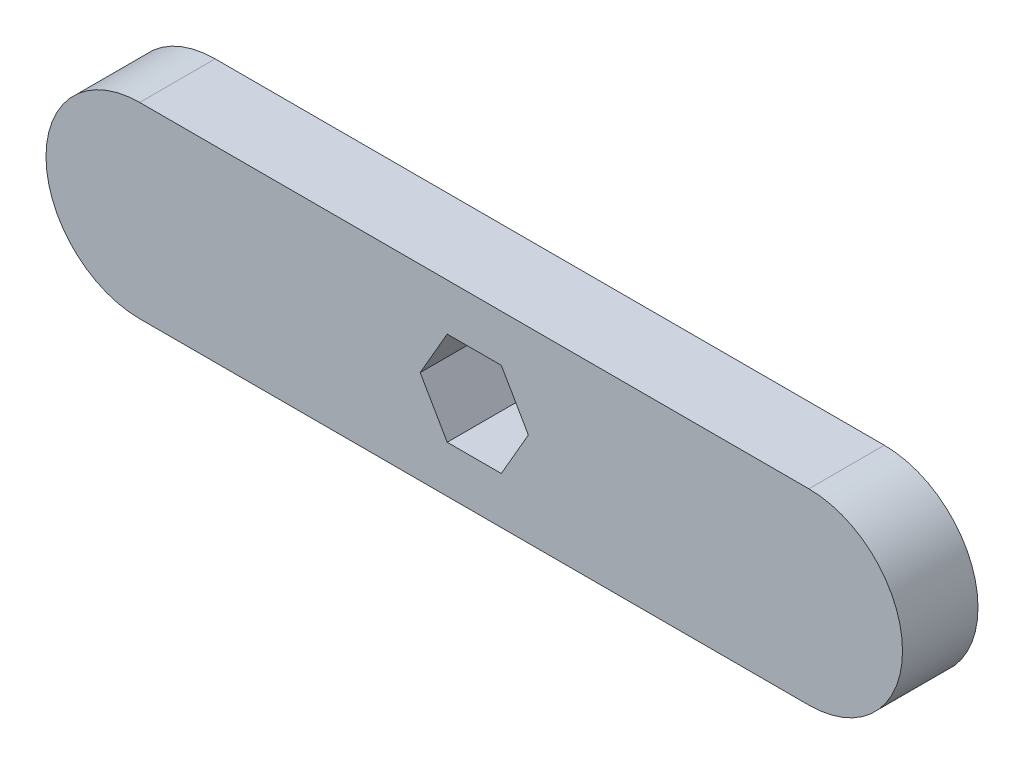
ISO-10303-21;
HEADER;
FILE_DESCRIPTION(('STEP AP214'),'2;1');
FILE_NAME('part.step','',(''),(''),'','','');
FILE_SCHEMA(('AUTOMOTIVE_DESIGN { 1 0 10303 214 1 1 1 1 }'));
ENDSEC;
DATA;
#1=APPLICATION_CONTEXT('core data for automotive mechanical design processes');
#2=APPLICATION_PROTOCOL_DEFINITION('international standard','automotive_design',2000,#1);
#3=PRODUCT_CONTEXT('',#1,'mechanical');
#4=PRODUCT('Part','Part','',(#3));
#5=PRODUCT_RELATED_PRODUCT_CATEGORY('part','',(#4));
#6=PRODUCT_DEFINITION_FORMATION('','',#4);
#7=PRODUCT_DEFINITION_CONTEXT('part definition',#1,'design');
#8=PRODUCT_DEFINITION('design','',#6,#7);
#9=PRODUCT_DEFINITION_SHAPE('','',#8);
#10=(LENGTH_UNIT() NAMED_UNIT(*) SI_UNIT(.MILLI.,.METRE.));
#11=(NAMED_UNIT(*) PLANE_ANGLE_UNIT() SI_UNIT($,.RADIAN.));
#12=(NAMED_UNIT(*) SI_UNIT($,.STERADIAN.) SOLID_ANGLE_UNIT());
#13=UNCERTAINTY_MEASURE_WITH_UNIT(LENGTH_MEASURE(1.E-05),#10,'distance_accuracy_value','');
#14=(GEOMETRIC_REPRESENTATION_CONTEXT(3) GLOBAL_UNCERTAINTY_ASSIGNED_CONTEXT((#13)) GLOBAL_UNIT_ASSIGNED_CONTEXT((#10,
#11,#12)) REPRESENTATION_CONTEXT('',''));
#15=CARTESIAN_POINT('',(0.,0.,0.));
#16=DIRECTION('',(0.,0.,1.));
#17=DIRECTION('',(1.,0.,0.));
#18=AXIS2_PLACEMENT_3D('',#15,#16,#17);
#19=CARTESIAN_POINT('',(-25.,0.,5.64));
#20=DIRECTION('',(0.,0.,1.));
#21=DIRECTION('',(1.,0.,0.));
#22=AXIS2_PLACEMENT_3D('',#19,#20,#21);
#23=PLANE('',#22);
#24=CARTESIAN_POINT('',(-25.,0.,5.64));
#25=DIRECTION('',(0.,0.,1.));
#26=DIRECTION('',(1.,0.,0.));
#27=AXIS2_PLACEMENT_3D('',#24,#25,#26);
#28=CIRCLE('',#27,7.);
#29=CARTESIAN_POINT('',(-25.,7.,5.64));
#30=VERTEX_POINT('',#29);
#31=CARTESIAN_POINT('',(-25.,-7.,5.64));
#32=VERTEX_POINT('',#31);
#33=EDGE_CURVE('E161',#30,#32,#28,.T.);
#34=ORIENTED_EDGE('',*,*,#33,.T.);
#35=DIRECTION('',(1.,0.,0.));
#36=VECTOR('',#35,1.);
#37=CARTESIAN_POINT('',(-25.,-7.,5.64));
#38=LINE('',#37,#36);
#39=CARTESIAN_POINT('',(25.,-7.,5.64));
#40=VERTEX_POINT('',#39);
#41=EDGE_CURVE('E164',#32,#40,#38,.T.);
#42=ORIENTED_EDGE('',*,*,#41,.T.);
#43=CARTESIAN_POINT('',(25.,0.,5.64));
#44=DIRECTION('',(0.,0.,1.));
#45=DIRECTION('',(1.,0.,0.));
#46=AXIS2_PLACEMENT_3D('',#43,#44,#45);
#47=CIRCLE('',#46,7.);
#48=CARTESIAN_POINT('',(25.,7.00000000000001,5.64));
#49=VERTEX_POINT('',#48);
#50=EDGE_CURVE('E167',#40,#49,#47,.T.);
#51=ORIENTED_EDGE('',*,*,#50,.T.);
#52=DIRECTION('',(-1.,0.,0.));
#53=VECTOR('',#52,1.);
#54=CARTESIAN_POINT('',(-25.,7.,5.64));
#55=LINE('',#54,#53);
#56=EDGE_CURVE('E169',#49,#30,#55,.T.);
#57=ORIENTED_EDGE('',*,*,#56,.T.);
#58=EDGE_LOOP('',(#34,#42,#51,#57));
#59=FACE_BOUND('',#58,.T.);
#60=DIRECTION('',(-0.5,-0.866025403784439,0.));
#61=VECTOR('',#60,1.);
#62=CARTESIAN_POINT('',(-2.02072594216369,3.5,5.64));
#63=LINE('',#62,#61);
#64=CARTESIAN_POINT('',(-2.02072594216369,3.5,5.64));
#65=VERTEX_POINT('',#64);
#66=CARTESIAN_POINT('',(-4.04145188432738,0.,5.64));
#67=VERTEX_POINT('',#66);
#68=EDGE_CURVE('E118',#65,#67,#63,.T.);
#69=ORIENTED_EDGE('',*,*,#68,.F.);
#70=DIRECTION('',(-1.,0.,0.));
#71=VECTOR('',#70,1.);
#72=CARTESIAN_POINT('',(2.02072594216369,3.5,5.64));
#73=LINE('',#72,#71);
#74=CARTESIAN_POINT('',(2.02072594216369,3.5,5.64));
#75=VERTEX_POINT('',#74);
#76=EDGE_CURVE('E110',#75,#65,#73,.T.);
#77=ORIENTED_EDGE('',*,*,#76,.F.);
#78=DIRECTION('',(-0.5,0.866025403784439,0.));
#79=VECTOR('',#78,1.);
#80=CARTESIAN_POINT('',(4.04145188432738,0.,5.64));
#81=LINE('',#80,#79);
#82=CARTESIAN_POINT('',(4.04145188432738,0.,5.64));
#83=VERTEX_POINT('',#82);
#84=EDGE_CURVE('E139',#83,#75,#81,.T.);
#85=ORIENTED_EDGE('',*,*,#84,.F.);
#86=DIRECTION('',(0.5,0.866025403784439,0.));
#87=VECTOR('',#86,1.);
#88=CARTESIAN_POINT('',(2.02072594216369,-3.5,5.64));
#89=LINE('',#88,#87);
#90=CARTESIAN_POINT('',(2.02072594216369,-3.5,5.64));
#91=VERTEX_POINT('',#90);
#92=EDGE_CURVE('E137',#91,#83,#89,.T.);
#93=ORIENTED_EDGE('',*,*,#92,.F.);
#94=DIRECTION('',(1.,0.,0.));
#95=VECTOR('',#94,1.);
#96=CARTESIAN_POINT('',(-2.02072594216369,-3.5,5.64));
#97=LINE('',#96,#95);
#98=CARTESIAN_POINT('',(-2.02072594216369,-3.5,5.64));
#99=VERTEX_POINT('',#98);
#100=EDGE_CURVE('E133',#99,#91,#97,.T.);
#101=ORIENTED_EDGE('',*,*,#100,.F.);
#102=DIRECTION('',(0.5,-0.866025403784439,0.));
#103=VECTOR('',#102,1.);
#104=CARTESIAN_POINT('',(-4.04145188432738,0.,5.64));
#105=LINE('',#104,#103);
#106=EDGE_CURVE('E131',#67,#99,#105,.T.);
#107=ORIENTED_EDGE('',*,*,#106,.F.);
#108=EDGE_LOOP('',(#69,#77,#85,#93,#101,#107));
#109=FACE_BOUND('',#108,.T.);
#110=ADVANCED_FACE('F33',(#59,#109),#23,.T.);
#111=CARTESIAN_POINT('',(-25.,0.,0.));
#112=DIRECTION('',(0.,0.,1.));
#113=DIRECTION('',(1.,0.,0.));
#114=AXIS2_PLACEMENT_3D('',#111,#112,#113);
#115=PLANE('',#114);
#116=CARTESIAN_POINT('',(-25.,0.,0.));
#117=DIRECTION('',(0.,0.,1.));
#118=DIRECTION('',(1.,0.,0.));
#119=AXIS2_PLACEMENT_3D('',#116,#117,#118);
#120=CIRCLE('',#119,7.);
#121=CARTESIAN_POINT('',(-25.,7.,0.));
#122=VERTEX_POINT('',#121);
#123=CARTESIAN_POINT('',(-25.,-7.,0.));
#124=VERTEX_POINT('',#123);
#125=EDGE_CURVE('E126',#122,#124,#120,.T.);
#126=ORIENTED_EDGE('',*,*,#125,.F.);
#127=DIRECTION('',(-1.,0.,0.));
#128=VECTOR('',#127,1.);
#129=CARTESIAN_POINT('',(-25.,7.,0.));
#130=LINE('',#129,#128);
#131=CARTESIAN_POINT('',(25.,7.00000000000001,0.));
#132=VERTEX_POINT('',#131);
#133=EDGE_CURVE('E165',#132,#122,#130,.T.);
#134=ORIENTED_EDGE('',*,*,#133,.F.);
#135=CARTESIAN_POINT('',(25.,0.,0.));
#136=DIRECTION('',(0.,0.,1.));
#137=DIRECTION('',(1.,0.,0.));
#138=AXIS2_PLACEMENT_3D('',#135,#136,#137);
#139=CIRCLE('',#138,7.);
#140=CARTESIAN_POINT('',(25.,-7.,0.));
#141=VERTEX_POINT('',#140);
#142=EDGE_CURVE('E176',#141,#132,#139,.T.);
#143=ORIENTED_EDGE('',*,*,#142,.F.);
#144=DIRECTION('',(1.,0.,0.));
#145=VECTOR('',#144,1.);
#146=CARTESIAN_POINT('',(-25.,-7.,0.));
#147=LINE('',#146,#145);
#148=EDGE_CURVE('E174',#124,#141,#147,.T.);
#149=ORIENTED_EDGE('',*,*,#148,.F.);
#150=EDGE_LOOP('',(#126,#134,#143,#149));
#151=FACE_BOUND('',#150,.T.);
#152=DIRECTION('',(-1.,0.,0.));
#153=VECTOR('',#152,1.);
#154=CARTESIAN_POINT('',(2.02072594216369,3.5,0.));
#155=LINE('',#154,#153);
#156=CARTESIAN_POINT('',(2.02072594216369,3.5,0.));
#157=VERTEX_POINT('',#156);
#158=CARTESIAN_POINT('',(-2.02072594216369,3.5,0.));
#159=VERTEX_POINT('',#158);
#160=EDGE_CURVE('E56',#157,#159,#155,.T.);
#161=ORIENTED_EDGE('',*,*,#160,.T.);
#162=DIRECTION('',(-0.5,-0.866025403784439,0.));
#163=VECTOR('',#162,1.);
#164=CARTESIAN_POINT('',(-2.02072594216369,3.5,0.));
#165=LINE('',#164,#163);
#166=CARTESIAN_POINT('',(-4.04145188432738,0.,0.));
#167=VERTEX_POINT('',#166);
#168=EDGE_CURVE('E125',#159,#167,#165,.T.);
#169=ORIENTED_EDGE('',*,*,#168,.T.);
#170=DIRECTION('',(0.5,-0.866025403784439,0.));
#171=VECTOR('',#170,1.);
#172=CARTESIAN_POINT('',(-4.04145188432738,0.,0.));
#173=LINE('',#172,#171);
#174=CARTESIAN_POINT('',(-2.02072594216369,-3.5,0.));
#175=VERTEX_POINT('',#174);
#176=EDGE_CURVE('E143',#167,#175,#173,.T.);
#177=ORIENTED_EDGE('',*,*,#176,.T.);
#178=DIRECTION('',(1.,0.,0.));
#179=VECTOR('',#178,1.);
#180=CARTESIAN_POINT('',(-2.02072594216369,-3.5,0.));
#181=LINE('',#180,#179);
#182=CARTESIAN_POINT('',(2.02072594216369,-3.5,0.));
#183=VERTEX_POINT('',#182);
#184=EDGE_CURVE('E146',#175,#183,#181,.T.);
#185=ORIENTED_EDGE('',*,*,#184,.T.);
#186=DIRECTION('',(0.5,0.866025403784439,0.));
#187=VECTOR('',#186,1.);
#188=CARTESIAN_POINT('',(2.02072594216369,-3.5,0.));
#189=LINE('',#188,#187);
#190=CARTESIAN_POINT('',(4.04145188432738,0.,0.));
#191=VERTEX_POINT('',#190);
#192=EDGE_CURVE('E149',#183,#191,#189,.T.);
#193=ORIENTED_EDGE('',*,*,#192,.T.);
#194=DIRECTION('',(-0.5,0.866025403784439,0.));
#195=VECTOR('',#194,1.);
#196=CARTESIAN_POINT('',(4.04145188432738,0.,0.));
#197=LINE('',#196,#195);
#198=EDGE_CURVE('E119',#191,#157,#197,.T.);
#199=ORIENTED_EDGE('',*,*,#198,.T.);
#200=EDGE_LOOP('',(#161,#169,#177,#185,#193,#199));
#201=FACE_BOUND('',#200,.T.);
#202=ADVANCED_FACE('F194',(#151,#201),#115,.F.);
#203=CARTESIAN_POINT('',(-25.,0.,5.64));
#204=DIRECTION('',(0.,0.,-1.));
#205=DIRECTION('',(-1.,0.,0.));
#206=AXIS2_PLACEMENT_3D('',#203,#204,#205);
#207=CYLINDRICAL_SURFACE('',#206,7.);
#208=ORIENTED_EDGE('',*,*,#125,.T.);
#209=DIRECTION('',(0.,0.,-1.));
#210=VECTOR('',#209,1.);
#211=CARTESIAN_POINT('',(-25.,-7.,5.64));
#212=LINE('',#211,#210);
#213=EDGE_CURVE('E11',#32,#124,#212,.T.);
#214=ORIENTED_EDGE('',*,*,#213,.F.);
#215=ORIENTED_EDGE('',*,*,#33,.F.);
#216=DIRECTION('',(0.,0.,-1.));
#217=VECTOR('',#216,1.);
#218=CARTESIAN_POINT('',(-25.,7.,5.64));
#219=LINE('',#218,#217);
#220=EDGE_CURVE('E171',#30,#122,#219,.T.);
#221=ORIENTED_EDGE('',*,*,#220,.T.);
#222=EDGE_LOOP('',(#208,#214,#215,#221));
#223=FACE_BOUND('',#222,.T.);
#224=ADVANCED_FACE('F35',(#223),#207,.T.);
#225=CARTESIAN_POINT('',(-25.,-7.,5.64));
#226=DIRECTION('',(0.,1.,0.));
#227=DIRECTION('',(-1.,0.,0.));
#228=AXIS2_PLACEMENT_3D('',#225,#226,#227);
#229=PLANE('',#228);
#230=ORIENTED_EDGE('',*,*,#148,.T.);
#231=DIRECTION('',(0.,0.,-1.));
#232=VECTOR('',#231,1.);
#233=CARTESIAN_POINT('',(25.,-7.,5.64));
#234=LINE('',#233,#232);
#235=EDGE_CURVE('E41',#40,#141,#234,.T.);
#236=ORIENTED_EDGE('',*,*,#235,.F.);
#237=ORIENTED_EDGE('',*,*,#41,.F.);
#238=ORIENTED_EDGE('',*,*,#213,.T.);
#239=EDGE_LOOP('',(#230,#236,#237,#238));
#240=FACE_BOUND('',#239,.T.);
#241=ADVANCED_FACE('F204',(#240),#229,.F.);
#242=CARTESIAN_POINT('',(25.,0.,5.64));
#243=DIRECTION('',(0.,0.,-1.));
#244=DIRECTION('',(-1.,0.,0.));
#245=AXIS2_PLACEMENT_3D('',#242,#243,#244);
#246=CYLINDRICAL_SURFACE('',#245,7.);
#247=ORIENTED_EDGE('',*,*,#142,.T.);
#248=DIRECTION('',(0.,0.,-1.));
#249=VECTOR('',#248,1.);
#250=CARTESIAN_POINT('',(25.,7.00000000000001,5.64));
#251=LINE('',#250,#249);
#252=EDGE_CURVE('E181',#49,#132,#251,.T.);
#253=ORIENTED_EDGE('',*,*,#252,.F.);
#254=ORIENTED_EDGE('',*,*,#50,.F.);
#255=ORIENTED_EDGE('',*,*,#235,.T.);
#256=EDGE_LOOP('',(#247,#253,#254,#255));
#257=FACE_BOUND('',#256,.T.);
#258=ADVANCED_FACE('F188',(#257),#246,.T.);
#259=CARTESIAN_POINT('',(-25.,7.,5.64));
#260=DIRECTION('',(0.,-1.,0.));
#261=DIRECTION('',(1.,0.,0.));
#262=AXIS2_PLACEMENT_3D('',#259,#260,#261);
#263=PLANE('',#262);
#264=ORIENTED_EDGE('',*,*,#133,.T.);
#265=ORIENTED_EDGE('',*,*,#220,.F.);
#266=ORIENTED_EDGE('',*,*,#56,.F.);
#267=ORIENTED_EDGE('',*,*,#252,.T.);
#268=EDGE_LOOP('',(#264,#265,#266,#267));
#269=FACE_BOUND('',#268,.T.);
#270=ADVANCED_FACE('F198',(#269),#263,.F.);
#271=CARTESIAN_POINT('',(2.02072594216369,3.5,5.64));
#272=DIRECTION('',(0.,-1.,0.));
#273=DIRECTION('',(1.,0.,0.));
#274=AXIS2_PLACEMENT_3D('',#271,#272,#273);
#275=PLANE('',#274);
#276=ORIENTED_EDGE('',*,*,#160,.F.);
#277=DIRECTION('',(0.,0.,-1.));
#278=VECTOR('',#277,1.);
#279=CARTESIAN_POINT('',(2.02072594216369,3.5,5.64));
#280=LINE('',#279,#278);
#281=EDGE_CURVE('E114',#75,#157,#280,.T.);
#282=ORIENTED_EDGE('',*,*,#281,.F.);
#283=ORIENTED_EDGE('',*,*,#76,.T.);
#284=DIRECTION('',(0.,0.,-1.));
#285=VECTOR('',#284,1.);
#286=CARTESIAN_POINT('',(-2.02072594216369,3.5,5.64));
#287=LINE('',#286,#285);
#288=EDGE_CURVE('E113',#65,#159,#287,.T.);
#289=ORIENTED_EDGE('',*,*,#288,.T.);
#290=EDGE_LOOP('',(#276,#282,#283,#289));
#291=FACE_BOUND('',#290,.T.);
#292=ADVANCED_FACE('F112',(#291),#275,.T.);
#293=CARTESIAN_POINT('',(-2.02072594216369,3.5,5.64));
#294=DIRECTION('',(0.866025403784439,-0.5,0.));
#295=DIRECTION('',(0.5,0.866025403784439,0.));
#296=AXIS2_PLACEMENT_3D('',#293,#294,#295);
#297=PLANE('',#296);
#298=ORIENTED_EDGE('',*,*,#168,.F.);
#299=ORIENTED_EDGE('',*,*,#288,.F.);
#300=ORIENTED_EDGE('',*,*,#68,.T.);
#301=DIRECTION('',(0.,0.,-1.));
#302=VECTOR('',#301,1.);
#303=CARTESIAN_POINT('',(-4.04145188432738,0.,5.64));
#304=LINE('',#303,#302);
#305=EDGE_CURVE('E127',#67,#167,#304,.T.);
#306=ORIENTED_EDGE('',*,*,#305,.T.);
#307=EDGE_LOOP('',(#298,#299,#300,#306));
#308=FACE_BOUND('',#307,.T.);
#309=ADVANCED_FACE('F122',(#308),#297,.T.);
#310=CARTESIAN_POINT('',(-4.04145188432738,0.,5.64));
#311=DIRECTION('',(0.866025403784439,0.5,0.));
#312=DIRECTION('',(-0.5,0.866025403784439,0.));
#313=AXIS2_PLACEMENT_3D('',#310,#311,#312);
#314=PLANE('',#313);
#315=ORIENTED_EDGE('',*,*,#176,.F.);
#316=ORIENTED_EDGE('',*,*,#305,.F.);
#317=ORIENTED_EDGE('',*,*,#106,.T.);
#318=DIRECTION('',(0.,0.,-1.));
#319=VECTOR('',#318,1.);
#320=CARTESIAN_POINT('',(-2.02072594216369,-3.5,5.64));
#321=LINE('',#320,#319);
#322=EDGE_CURVE('E158',#99,#175,#321,.T.);
#323=ORIENTED_EDGE('',*,*,#322,.T.);
#324=EDGE_LOOP('',(#315,#316,#317,#323));
#325=FACE_BOUND('',#324,.T.);
#326=ADVANCED_FACE('F227',(#325),#314,.T.);
#327=CARTESIAN_POINT('',(-2.02072594216369,-3.5,5.64));
#328=DIRECTION('',(0.,1.,0.));
#329=DIRECTION('',(-1.,0.,0.));
#330=AXIS2_PLACEMENT_3D('',#327,#328,#329);
#331=PLANE('',#330);
#332=ORIENTED_EDGE('',*,*,#184,.F.);
#333=ORIENTED_EDGE('',*,*,#322,.F.);
#334=ORIENTED_EDGE('',*,*,#100,.T.);
#335=DIRECTION('',(0.,0.,-1.));
#336=VECTOR('',#335,1.);
#337=CARTESIAN_POINT('',(2.02072594216369,-3.5,5.64));
#338=LINE('',#337,#336);
#339=EDGE_CURVE('E156',#91,#183,#338,.T.);
#340=ORIENTED_EDGE('',*,*,#339,.T.);
#341=EDGE_LOOP('',(#332,#333,#334,#340));
#342=FACE_BOUND('',#341,.T.);
#343=ADVANCED_FACE('F231',(#342),#331,.T.);
#344=CARTESIAN_POINT('',(2.02072594216369,-3.5,5.64));
#345=DIRECTION('',(-0.866025403784439,0.5,0.));
#346=DIRECTION('',(-0.5,-0.866025403784439,0.));
#347=AXIS2_PLACEMENT_3D('',#344,#345,#346);
#348=PLANE('',#347);
#349=ORIENTED_EDGE('',*,*,#192,.F.);
#350=ORIENTED_EDGE('',*,*,#339,.F.);
#351=ORIENTED_EDGE('',*,*,#92,.T.);
#352=DIRECTION('',(0.,0.,-1.));
#353=VECTOR('',#352,1.);
#354=CARTESIAN_POINT('',(4.04145188432738,0.,5.64));
#355=LINE('',#354,#353);
#356=EDGE_CURVE('E48',#83,#191,#355,.T.);
#357=ORIENTED_EDGE('',*,*,#356,.T.);
#358=EDGE_LOOP('',(#349,#350,#351,#357));
#359=FACE_BOUND('',#358,.T.);
#360=ADVANCED_FACE('F237',(#359),#348,.T.);
#361=CARTESIAN_POINT('',(4.04145188432738,0.,5.64));
#362=DIRECTION('',(-0.866025403784439,-0.5,0.));
#363=DIRECTION('',(0.5,-0.866025403784438,0.));
#364=AXIS2_PLACEMENT_3D('',#361,#362,#363);
#365=PLANE('',#364);
#366=ORIENTED_EDGE('',*,*,#198,.F.);
#367=ORIENTED_EDGE('',*,*,#356,.F.);
#368=ORIENTED_EDGE('',*,*,#84,.T.);
#369=ORIENTED_EDGE('',*,*,#281,.T.);
#370=EDGE_LOOP('',(#366,#367,#368,#369));
#371=FACE_BOUND('',#370,.T.);
#372=ADVANCED_FACE('F241',(#371),#365,.T.);
#373=CLOSED_SHELL('',(#110,#202,#224,#241,#258,#270,#292,#309,#326,#343,#360,#372));
#374=MANIFOLD_SOLID_BREP('B2',#373);
#375=ADVANCED_BREP_SHAPE_REPRESENTATION('',(#18,#374),#14);
#376=SHAPE_DEFINITION_REPRESENTATION(#9,#375);
ENDSEC;
END-ISO-10303-21;
